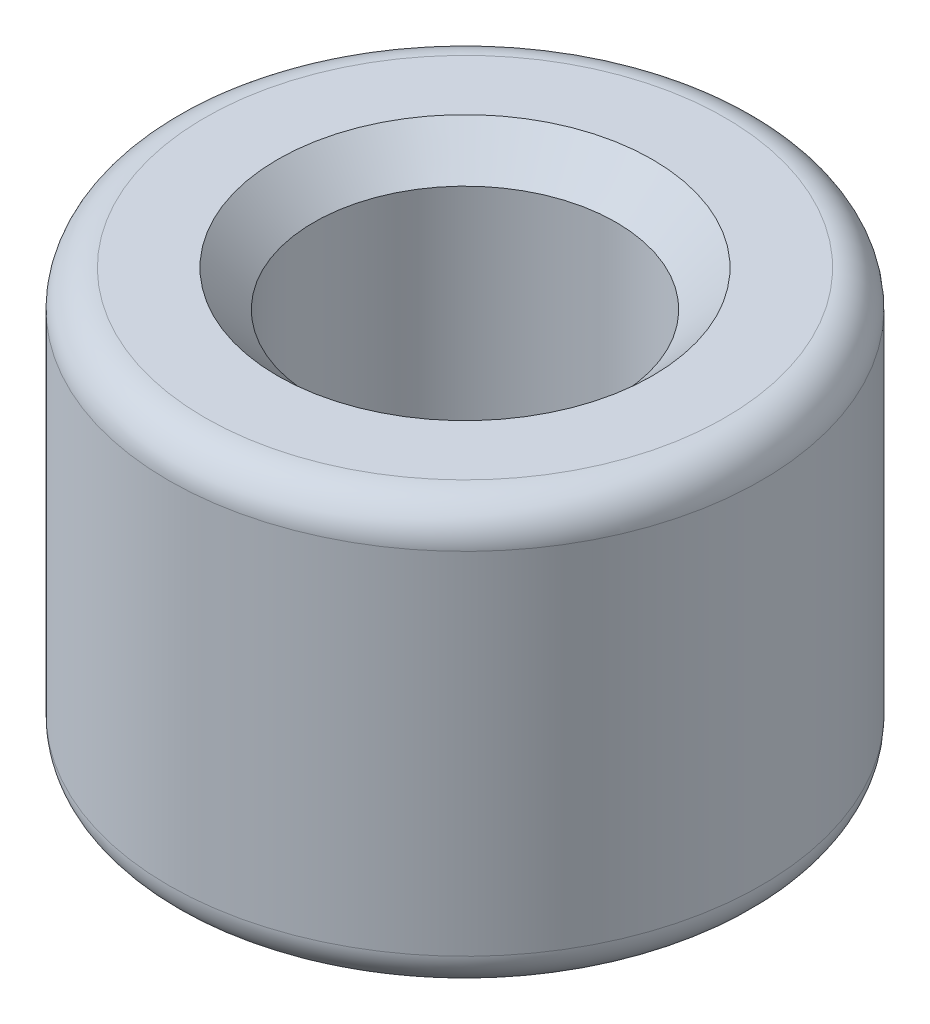
ISO-10303-21;
HEADER;
FILE_DESCRIPTION(('STEP AP214'),'2;1');
FILE_NAME('part.step','',(''),(''),'','','');
FILE_SCHEMA(('AUTOMOTIVE_DESIGN { 1 0 10303 214 1 1 1 1 }'));
ENDSEC;
DATA;
#1=APPLICATION_CONTEXT('core data for automotive mechanical design processes');
#2=APPLICATION_PROTOCOL_DEFINITION('international standard','automotive_design',2000,#1);
#3=PRODUCT_CONTEXT('',#1,'mechanical');
#4=PRODUCT('Part','Part','',(#3));
#5=PRODUCT_RELATED_PRODUCT_CATEGORY('part','',(#4));
#6=PRODUCT_DEFINITION_FORMATION('','',#4);
#7=PRODUCT_DEFINITION_CONTEXT('part definition',#1,'design');
#8=PRODUCT_DEFINITION('design','',#6,#7);
#9=PRODUCT_DEFINITION_SHAPE('','',#8);
#10=(LENGTH_UNIT() NAMED_UNIT(*) SI_UNIT(.MILLI.,.METRE.));
#11=(NAMED_UNIT(*) PLANE_ANGLE_UNIT() SI_UNIT($,.RADIAN.));
#12=(NAMED_UNIT(*) SI_UNIT($,.STERADIAN.) SOLID_ANGLE_UNIT());
#13=UNCERTAINTY_MEASURE_WITH_UNIT(LENGTH_MEASURE(1.E-05),#10,'distance_accuracy_value','');
#14=(GEOMETRIC_REPRESENTATION_CONTEXT(3) GLOBAL_UNCERTAINTY_ASSIGNED_CONTEXT((#13)) GLOBAL_UNIT_ASSIGNED_CONTEXT((#10,
#11,#12)) REPRESENTATION_CONTEXT('',''));
#15=CARTESIAN_POINT('',(0.,0.,0.));
#16=DIRECTION('',(0.,0.,1.));
#17=DIRECTION('',(1.,0.,0.));
#18=AXIS2_PLACEMENT_3D('',#15,#16,#17);
#19=CARTESIAN_POINT('',(0.,1.75,0.));
#20=DIRECTION('',(0.,1.,0.));
#21=DIRECTION('',(0.,0.,1.));
#22=AXIS2_PLACEMENT_3D('',#19,#20,#21);
#23=PLANE('',#22);
#24=CARTESIAN_POINT('',(0.,1.75,0.));
#25=DIRECTION('',(0.,1.,0.));
#26=DIRECTION('',(0.,0.,1.));
#27=AXIS2_PLACEMENT_3D('',#24,#25,#26);
#28=CIRCLE('',#27,2.15);
#29=CARTESIAN_POINT('',(0.,1.75,2.15));
#30=VERTEX_POINT('',#29);
#31=EDGE_CURVE('E10',#30,#30,#28,.T.);
#32=ORIENTED_EDGE('',*,*,#31,.T.);
#33=EDGE_LOOP('',(#32));
#34=FACE_BOUND('',#33,.T.);
#35=CARTESIAN_POINT('',(0.,1.75,0.));
#36=DIRECTION('',(0.,1.,0.));
#37=DIRECTION('',(0.,0.,1.));
#38=AXIS2_PLACEMENT_3D('',#35,#36,#37);
#39=CIRCLE('',#38,1.55);
#40=CARTESIAN_POINT('',(0.,1.75,1.55));
#41=VERTEX_POINT('',#40);
#42=EDGE_CURVE('E55',#41,#41,#39,.F.);
#43=ORIENTED_EDGE('',*,*,#42,.T.);
#44=EDGE_LOOP('',(#43));
#45=FACE_BOUND('',#44,.T.);
#46=ADVANCED_FACE('F35',(#34,#45),#23,.T.);
#47=CARTESIAN_POINT('',(0.,-1.75,0.));
#48=DIRECTION('',(0.,1.,0.));
#49=DIRECTION('',(0.,0.,1.));
#50=AXIS2_PLACEMENT_3D('',#47,#48,#49);
#51=PLANE('',#50);
#52=CARTESIAN_POINT('',(0.,-1.75,0.));
#53=DIRECTION('',(0.,1.,0.));
#54=DIRECTION('',(0.,0.,1.));
#55=AXIS2_PLACEMENT_3D('',#52,#53,#54);
#56=CIRCLE('',#55,2.15);
#57=CARTESIAN_POINT('',(0.,-1.75,2.15));
#58=VERTEX_POINT('',#57);
#59=EDGE_CURVE('E42',#58,#58,#56,.F.);
#60=ORIENTED_EDGE('',*,*,#59,.T.);
#61=EDGE_LOOP('',(#60));
#62=FACE_BOUND('',#61,.T.);
#63=CARTESIAN_POINT('',(0.,-1.75,0.));
#64=DIRECTION('',(0.,1.,0.));
#65=DIRECTION('',(0.,0.,1.));
#66=AXIS2_PLACEMENT_3D('',#63,#64,#65);
#67=CIRCLE('',#66,1.55);
#68=CARTESIAN_POINT('',(0.,-1.75,1.55));
#69=VERTEX_POINT('',#68);
#70=EDGE_CURVE('E64',#69,#69,#67,.T.);
#71=ORIENTED_EDGE('',*,*,#70,.T.);
#72=EDGE_LOOP('',(#71));
#73=FACE_BOUND('',#72,.T.);
#74=ADVANCED_FACE('F68',(#62,#73),#51,.F.);
#75=CARTESIAN_POINT('',(0.,1.75,0.));
#76=DIRECTION('',(0.,-1.,0.));
#77=DIRECTION('',(0.,0.,-1.));
#78=AXIS2_PLACEMENT_3D('',#75,#76,#77);
#79=CYLINDRICAL_SURFACE('',#78,2.45);
#80=CARTESIAN_POINT('',(0.,-1.45,0.));
#81=DIRECTION('',(0.,1.,0.));
#82=DIRECTION('',(0.,0.,1.));
#83=AXIS2_PLACEMENT_3D('',#80,#81,#82);
#84=CIRCLE('',#83,2.45);
#85=CARTESIAN_POINT('',(0.,-1.45,2.45));
#86=VERTEX_POINT('',#85);
#87=EDGE_CURVE('E46',#86,#86,#84,.T.);
#88=ORIENTED_EDGE('',*,*,#87,.T.);
#89=EDGE_LOOP('',(#88));
#90=FACE_BOUND('',#89,.T.);
#91=CARTESIAN_POINT('',(0.,1.45,0.));
#92=DIRECTION('',(0.,1.,0.));
#93=DIRECTION('',(0.,0.,1.));
#94=AXIS2_PLACEMENT_3D('',#91,#92,#93);
#95=CIRCLE('',#94,2.45);
#96=CARTESIAN_POINT('',(0.,1.45,2.45));
#97=VERTEX_POINT('',#96);
#98=EDGE_CURVE('E50',#97,#97,#95,.F.);
#99=ORIENTED_EDGE('',*,*,#98,.T.);
#100=EDGE_LOOP('',(#99));
#101=FACE_BOUND('',#100,.T.);
#102=ADVANCED_FACE('F83',(#90,#101),#79,.T.);
#103=CARTESIAN_POINT('',(0.,1.75,0.));
#104=DIRECTION('',(0.,-1.,0.));
#105=DIRECTION('',(0.,0.,-1.));
#106=AXIS2_PLACEMENT_3D('',#103,#104,#105);
#107=CYLINDRICAL_SURFACE('',#106,1.25);
#108=CARTESIAN_POINT('',(0.,-1.45,0.));
#109=DIRECTION('',(0.,1.,0.));
#110=DIRECTION('',(0.,0.,1.));
#111=AXIS2_PLACEMENT_3D('',#108,#109,#110);
#112=CIRCLE('',#111,1.25);
#113=CARTESIAN_POINT('',(0.,-1.45,1.25));
#114=VERTEX_POINT('',#113);
#115=EDGE_CURVE('E58',#114,#114,#112,.F.);
#116=ORIENTED_EDGE('',*,*,#115,.T.);
#117=EDGE_LOOP('',(#116));
#118=FACE_BOUND('',#117,.T.);
#119=CARTESIAN_POINT('',(0.,1.45,0.));
#120=DIRECTION('',(0.,1.,0.));
#121=DIRECTION('',(0.,0.,1.));
#122=AXIS2_PLACEMENT_3D('',#119,#120,#121);
#123=CIRCLE('',#122,1.25);
#124=CARTESIAN_POINT('',(0.,1.45,1.25));
#125=VERTEX_POINT('',#124);
#126=EDGE_CURVE('E61',#125,#125,#123,.T.);
#127=ORIENTED_EDGE('',*,*,#126,.T.);
#128=EDGE_LOOP('',(#127));
#129=FACE_BOUND('',#128,.T.);
#130=ADVANCED_FACE('F73',(#118,#129),#107,.F.);
#131=CARTESIAN_POINT('',(0.,-1.75,0.));
#132=DIRECTION('',(0.,-1.,0.));
#133=DIRECTION('',(0.,0.,-1.));
#134=AXIS2_PLACEMENT_3D('',#131,#132,#133);
#135=CONICAL_SURFACE('',#134,1.55,0.785398163397448);
#136=ORIENTED_EDGE('',*,*,#115,.F.);
#137=EDGE_LOOP('',(#136));
#138=FACE_BOUND('',#137,.T.);
#139=ORIENTED_EDGE('',*,*,#70,.F.);
#140=EDGE_LOOP('',(#139));
#141=FACE_BOUND('',#140,.T.);
#142=ADVANCED_FACE('F70',(#138,#141),#135,.F.);
#143=CARTESIAN_POINT('',(0.,1.45,0.));
#144=DIRECTION('',(0.,1.,0.));
#145=DIRECTION('',(0.,0.,1.));
#146=AXIS2_PLACEMENT_3D('',#143,#144,#145);
#147=CONICAL_SURFACE('',#146,1.25,0.785398163397449);
#148=ORIENTED_EDGE('',*,*,#42,.F.);
#149=EDGE_LOOP('',(#148));
#150=FACE_BOUND('',#149,.T.);
#151=ORIENTED_EDGE('',*,*,#126,.F.);
#152=EDGE_LOOP('',(#151));
#153=FACE_BOUND('',#152,.T.);
#154=ADVANCED_FACE('F72',(#150,#153),#147,.F.);
#155=CARTESIAN_POINT('',(0.,-1.45,0.));
#156=DIRECTION('',(0.,1.,0.));
#157=DIRECTION('',(0.,0.,1.));
#158=AXIS2_PLACEMENT_3D('',#155,#156,#157);
#159=TOROIDAL_SURFACE('',#158,2.15,0.3);
#160=ORIENTED_EDGE('',*,*,#59,.F.);
#161=EDGE_LOOP('',(#160));
#162=FACE_BOUND('',#161,.T.);
#163=ORIENTED_EDGE('',*,*,#87,.F.);
#164=EDGE_LOOP('',(#163));
#165=FACE_BOUND('',#164,.T.);
#166=ADVANCED_FACE('F80',(#162,#165),#159,.T.);
#167=CARTESIAN_POINT('',(0.,1.45,0.));
#168=DIRECTION('',(0.,1.,0.));
#169=DIRECTION('',(0.,0.,1.));
#170=AXIS2_PLACEMENT_3D('',#167,#168,#169);
#171=TOROIDAL_SURFACE('',#170,2.15,0.3);
#172=ORIENTED_EDGE('',*,*,#98,.F.);
#173=EDGE_LOOP('',(#172));
#174=FACE_BOUND('',#173,.T.);
#175=ORIENTED_EDGE('',*,*,#31,.F.);
#176=EDGE_LOOP('',(#175));
#177=FACE_BOUND('',#176,.T.);
#178=ADVANCED_FACE('F37',(#174,#177),#171,.T.);
#179=CLOSED_SHELL('',(#46,#74,#102,#130,#142,#154,#166,#178));
#180=MANIFOLD_SOLID_BREP('B2',#179);
#181=ADVANCED_BREP_SHAPE_REPRESENTATION('',(#18,#180),#14);
#182=SHAPE_DEFINITION_REPRESENTATION(#9,#181);
ENDSEC;
END-ISO-10303-21;
